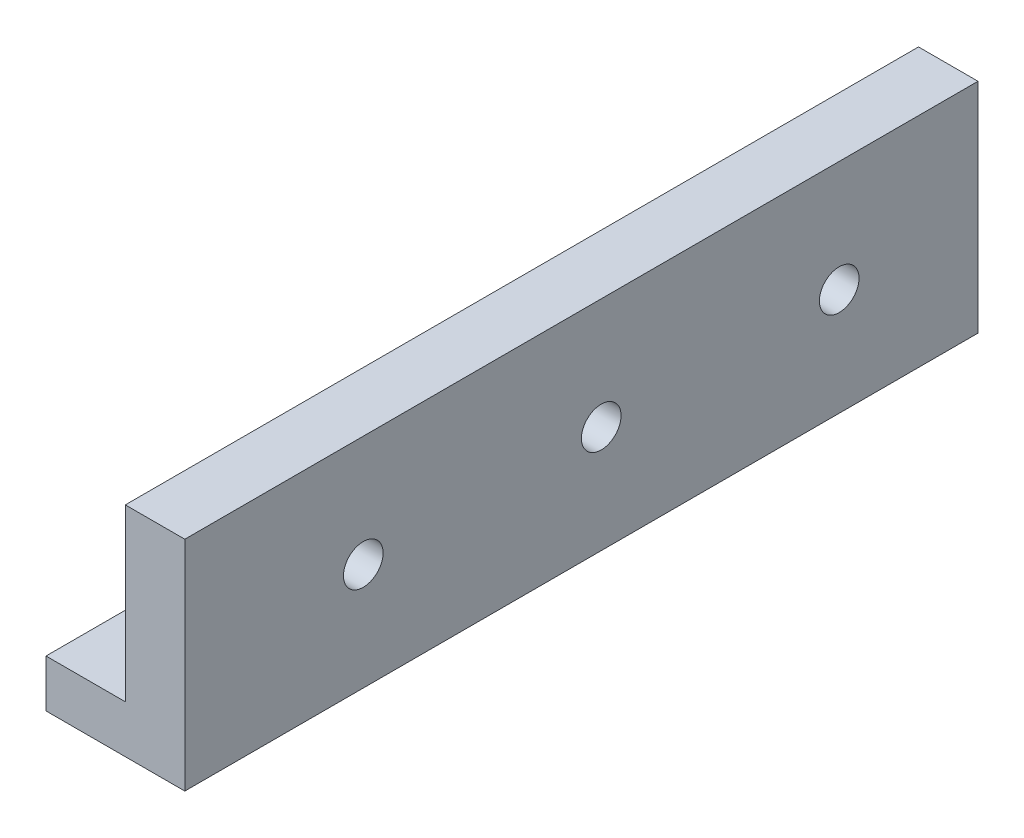
ISO-10303-21;
HEADER;
FILE_DESCRIPTION(('STEP AP214'),'2;1');
FILE_NAME('part.step','',(''),(''),'','','');
FILE_SCHEMA(('AUTOMOTIVE_DESIGN { 1 0 10303 214 1 1 1 1 }'));
ENDSEC;
DATA;
#1=APPLICATION_CONTEXT('core data for automotive mechanical design processes');
#2=APPLICATION_PROTOCOL_DEFINITION('international standard','automotive_design',2000,#1);
#3=PRODUCT_CONTEXT('',#1,'mechanical');
#4=PRODUCT('Part','Part','',(#3));
#5=PRODUCT_RELATED_PRODUCT_CATEGORY('part','',(#4));
#6=PRODUCT_DEFINITION_FORMATION('','',#4);
#7=PRODUCT_DEFINITION_CONTEXT('part definition',#1,'design');
#8=PRODUCT_DEFINITION('design','',#6,#7);
#9=PRODUCT_DEFINITION_SHAPE('','',#8);
#10=(LENGTH_UNIT() NAMED_UNIT(*) SI_UNIT(.MILLI.,.METRE.));
#11=(NAMED_UNIT(*) PLANE_ANGLE_UNIT() SI_UNIT($,.RADIAN.));
#12=(NAMED_UNIT(*) SI_UNIT($,.STERADIAN.) SOLID_ANGLE_UNIT());
#13=UNCERTAINTY_MEASURE_WITH_UNIT(LENGTH_MEASURE(1.E-05),#10,'distance_accuracy_value','');
#14=(GEOMETRIC_REPRESENTATION_CONTEXT(3) GLOBAL_UNCERTAINTY_ASSIGNED_CONTEXT((#13)) GLOBAL_UNIT_ASSIGNED_CONTEXT((#10,
#11,#12)) REPRESENTATION_CONTEXT('',''));
#15=CARTESIAN_POINT('',(0.,0.,0.));
#16=DIRECTION('',(0.,0.,1.));
#17=DIRECTION('',(1.,0.,0.));
#18=AXIS2_PLACEMENT_3D('',#15,#16,#17);
#19=CARTESIAN_POINT('',(9.98039404339138,208.805223982166,-200.));
#20=DIRECTION('',(0.,1.,0.));
#21=DIRECTION('',(0.,0.,1.));
#22=AXIS2_PLACEMENT_3D('',#19,#20,#21);
#23=PLANE('',#22);
#24=DIRECTION('',(-1.,0.,0.));
#25=VECTOR('',#24,1.);
#26=CARTESIAN_POINT('',(9.98039404339138,208.805223982166,0.));
#27=LINE('',#26,#25);
#28=CARTESIAN_POINT('',(9.98039404339138,208.805223982166,0.));
#29=VERTEX_POINT('',#28);
#30=CARTESIAN_POINT('',(-5.01960595660862,208.805223982166,0.));
#31=VERTEX_POINT('',#30);
#32=EDGE_CURVE('E118',#29,#31,#27,.T.);
#33=ORIENTED_EDGE('',*,*,#32,.F.);
#34=DIRECTION('',(0.,0.,1.));
#35=VECTOR('',#34,1.);
#36=CARTESIAN_POINT('',(9.98039404339138,208.805223982166,-200.));
#37=LINE('',#36,#35);
#38=CARTESIAN_POINT('',(9.98039404339138,208.805223982166,-200.));
#39=VERTEX_POINT('',#38);
#40=EDGE_CURVE('E11',#39,#29,#37,.T.);
#41=ORIENTED_EDGE('',*,*,#40,.F.);
#42=DIRECTION('',(-1.,0.,0.));
#43=VECTOR('',#42,1.);
#44=CARTESIAN_POINT('',(9.98039404339138,208.805223982166,-200.));
#45=LINE('',#44,#43);
#46=CARTESIAN_POINT('',(-5.01960595660862,208.805223982166,-200.));
#47=VERTEX_POINT('',#46);
#48=EDGE_CURVE('E133',#39,#47,#45,.T.);
#49=ORIENTED_EDGE('',*,*,#48,.T.);
#50=DIRECTION('',(0.,0.,1.));
#51=VECTOR('',#50,1.);
#52=CARTESIAN_POINT('',(-5.01960595660862,208.805223982166,-200.));
#53=LINE('',#52,#51);
#54=EDGE_CURVE('E36',#47,#31,#53,.T.);
#55=ORIENTED_EDGE('',*,*,#54,.T.);
#56=EDGE_LOOP('',(#33,#41,#49,#55));
#57=FACE_BOUND('',#56,.T.);
#58=ADVANCED_FACE('F33',(#57),#23,.T.);
#59=CARTESIAN_POINT('',(9.98039404339139,153.805223982166,-200.));
#60=DIRECTION('',(1.,0.,0.));
#61=DIRECTION('',(0.,1.,0.));
#62=AXIS2_PLACEMENT_3D('',#59,#60,#61);
#63=PLANE('',#62);
#64=CARTESIAN_POINT('',(9.98039404339139,180.805223982166,-45.));
#65=DIRECTION('',(1.,0.,0.));
#66=DIRECTION('',(0.,1.,0.));
#67=AXIS2_PLACEMENT_3D('',#64,#65,#66);
#68=CIRCLE('',#67,5.00000000000001);
#69=CARTESIAN_POINT('',(9.98039404339139,175.805223982166,-45.));
#70=VERTEX_POINT('',#69);
#71=EDGE_CURVE('E122',#70,#70,#68,.F.);
#72=ORIENTED_EDGE('',*,*,#71,.T.);
#73=EDGE_LOOP('',(#72));
#74=FACE_BOUND('',#73,.T.);
#75=CARTESIAN_POINT('',(9.98039404339139,180.805223982166,-105.));
#76=DIRECTION('',(1.,0.,0.));
#77=DIRECTION('',(0.,1.,0.));
#78=AXIS2_PLACEMENT_3D('',#75,#76,#77);
#79=CIRCLE('',#78,4.99999999999999);
#80=CARTESIAN_POINT('',(9.98039404339139,175.805223982166,-105.));
#81=VERTEX_POINT('',#80);
#82=EDGE_CURVE('E184',#81,#81,#79,.F.);
#83=ORIENTED_EDGE('',*,*,#82,.T.);
#84=EDGE_LOOP('',(#83));
#85=FACE_BOUND('',#84,.T.);
#86=CARTESIAN_POINT('',(9.98039404339139,180.805223982166,-165.));
#87=DIRECTION('',(1.,0.,0.));
#88=DIRECTION('',(0.,1.,0.));
#89=AXIS2_PLACEMENT_3D('',#86,#87,#88);
#90=CIRCLE('',#89,5.00000000000002);
#91=CARTESIAN_POINT('',(9.98039404339139,175.805223982166,-165.));
#92=VERTEX_POINT('',#91);
#93=EDGE_CURVE('E181',#92,#92,#90,.F.);
#94=ORIENTED_EDGE('',*,*,#93,.T.);
#95=EDGE_LOOP('',(#94));
#96=FACE_BOUND('',#95,.T.);
#97=DIRECTION('',(0.,1.,0.));
#98=VECTOR('',#97,1.);
#99=CARTESIAN_POINT('',(9.98039404339139,153.805223982166,0.));
#100=LINE('',#99,#98);
#101=CARTESIAN_POINT('',(9.98039404339139,153.805223982166,0.));
#102=VERTEX_POINT('',#101);
#103=EDGE_CURVE('E131',#102,#29,#100,.T.);
#104=ORIENTED_EDGE('',*,*,#103,.F.);
#105=DIRECTION('',(0.,0.,1.));
#106=VECTOR('',#105,1.);
#107=CARTESIAN_POINT('',(9.98039404339139,153.805223982166,-200.));
#108=LINE('',#107,#106);
#109=CARTESIAN_POINT('',(9.98039404339139,153.805223982166,-200.));
#110=VERTEX_POINT('',#109);
#111=EDGE_CURVE('E42',#110,#102,#108,.T.);
#112=ORIENTED_EDGE('',*,*,#111,.F.);
#113=DIRECTION('',(0.,1.,0.));
#114=VECTOR('',#113,1.);
#115=CARTESIAN_POINT('',(9.98039404339139,153.805223982166,-200.));
#116=LINE('',#115,#114);
#117=EDGE_CURVE('E108',#110,#39,#116,.T.);
#118=ORIENTED_EDGE('',*,*,#117,.T.);
#119=ORIENTED_EDGE('',*,*,#40,.T.);
#120=EDGE_LOOP('',(#104,#112,#118,#119));
#121=FACE_BOUND('',#120,.T.);
#122=ADVANCED_FACE('F141',(#74,#85,#96,#121),#63,.T.);
#123=CARTESIAN_POINT('',(-25.0196059566086,153.805223982166,-200.));
#124=DIRECTION('',(0.,-1.,0.));
#125=DIRECTION('',(0.,0.,-1.));
#126=AXIS2_PLACEMENT_3D('',#123,#124,#125);
#127=PLANE('',#126);
#128=DIRECTION('',(1.,0.,0.));
#129=VECTOR('',#128,1.);
#130=CARTESIAN_POINT('',(-25.0196059566086,153.805223982166,0.));
#131=LINE('',#130,#129);
#132=CARTESIAN_POINT('',(-25.0196059566086,153.805223982166,0.));
#133=VERTEX_POINT('',#132);
#134=EDGE_CURVE('E95',#133,#102,#131,.T.);
#135=ORIENTED_EDGE('',*,*,#134,.F.);
#136=DIRECTION('',(0.,0.,1.));
#137=VECTOR('',#136,1.);
#138=CARTESIAN_POINT('',(-25.0196059566086,153.805223982166,-200.));
#139=LINE('',#138,#137);
#140=CARTESIAN_POINT('',(-25.0196059566086,153.805223982166,-200.));
#141=VERTEX_POINT('',#140);
#142=EDGE_CURVE('E90',#141,#133,#139,.T.);
#143=ORIENTED_EDGE('',*,*,#142,.F.);
#144=DIRECTION('',(1.,0.,0.));
#145=VECTOR('',#144,1.);
#146=CARTESIAN_POINT('',(-25.0196059566086,153.805223982166,-200.));
#147=LINE('',#146,#145);
#148=EDGE_CURVE('E93',#141,#110,#147,.T.);
#149=ORIENTED_EDGE('',*,*,#148,.T.);
#150=ORIENTED_EDGE('',*,*,#111,.T.);
#151=EDGE_LOOP('',(#135,#143,#149,#150));
#152=FACE_BOUND('',#151,.T.);
#153=ADVANCED_FACE('F92',(#152),#127,.T.);
#154=CARTESIAN_POINT('',(-25.0196059566086,165.805223982166,-200.));
#155=DIRECTION('',(-1.,0.,0.));
#156=DIRECTION('',(0.,-1.,0.));
#157=AXIS2_PLACEMENT_3D('',#154,#155,#156);
#158=PLANE('',#157);
#159=DIRECTION('',(0.,-1.,0.));
#160=VECTOR('',#159,1.);
#161=CARTESIAN_POINT('',(-25.0196059566086,165.805223982166,0.));
#162=LINE('',#161,#160);
#163=CARTESIAN_POINT('',(-25.0196059566086,165.805223982166,0.));
#164=VERTEX_POINT('',#163);
#165=EDGE_CURVE('E128',#164,#133,#162,.T.);
#166=ORIENTED_EDGE('',*,*,#165,.F.);
#167=DIRECTION('',(0.,0.,1.));
#168=VECTOR('',#167,1.);
#169=CARTESIAN_POINT('',(-25.0196059566086,165.805223982166,-200.));
#170=LINE('',#169,#168);
#171=CARTESIAN_POINT('',(-25.0196059566086,165.805223982166,-200.));
#172=VERTEX_POINT('',#171);
#173=EDGE_CURVE('E100',#172,#164,#170,.T.);
#174=ORIENTED_EDGE('',*,*,#173,.F.);
#175=DIRECTION('',(0.,-1.,0.));
#176=VECTOR('',#175,1.);
#177=CARTESIAN_POINT('',(-25.0196059566086,165.805223982166,-200.));
#178=LINE('',#177,#176);
#179=EDGE_CURVE('E106',#172,#141,#178,.T.);
#180=ORIENTED_EDGE('',*,*,#179,.T.);
#181=ORIENTED_EDGE('',*,*,#142,.T.);
#182=EDGE_LOOP('',(#166,#174,#180,#181));
#183=FACE_BOUND('',#182,.T.);
#184=ADVANCED_FACE('F110',(#183),#158,.T.);
#185=CARTESIAN_POINT('',(-5.01960595660862,165.805223982166,-200.));
#186=DIRECTION('',(0.,1.,0.));
#187=DIRECTION('',(0.,0.,1.));
#188=AXIS2_PLACEMENT_3D('',#185,#186,#187);
#189=PLANE('',#188);
#190=DIRECTION('',(-1.,0.,0.));
#191=VECTOR('',#190,1.);
#192=CARTESIAN_POINT('',(-5.01960595660862,165.805223982166,0.));
#193=LINE('',#192,#191);
#194=CARTESIAN_POINT('',(-5.01960595660862,165.805223982166,0.));
#195=VERTEX_POINT('',#194);
#196=EDGE_CURVE('E125',#195,#164,#193,.T.);
#197=ORIENTED_EDGE('',*,*,#196,.F.);
#198=DIRECTION('',(0.,0.,1.));
#199=VECTOR('',#198,1.);
#200=CARTESIAN_POINT('',(-5.01960595660862,165.805223982166,-200.));
#201=LINE('',#200,#199);
#202=CARTESIAN_POINT('',(-5.01960595660862,165.805223982166,-200.));
#203=VERTEX_POINT('',#202);
#204=EDGE_CURVE('E136',#203,#195,#201,.T.);
#205=ORIENTED_EDGE('',*,*,#204,.F.);
#206=DIRECTION('',(-1.,0.,0.));
#207=VECTOR('',#206,1.);
#208=CARTESIAN_POINT('',(-5.01960595660862,165.805223982166,-200.));
#209=LINE('',#208,#207);
#210=EDGE_CURVE('E111',#203,#172,#209,.T.);
#211=ORIENTED_EDGE('',*,*,#210,.T.);
#212=ORIENTED_EDGE('',*,*,#173,.T.);
#213=EDGE_LOOP('',(#197,#205,#211,#212));
#214=FACE_BOUND('',#213,.T.);
#215=ADVANCED_FACE('F157',(#214),#189,.T.);
#216=CARTESIAN_POINT('',(-5.01960595660862,208.805223982166,-200.));
#217=DIRECTION('',(-1.,0.,0.));
#218=DIRECTION('',(0.,-1.,0.));
#219=AXIS2_PLACEMENT_3D('',#216,#217,#218);
#220=PLANE('',#219);
#221=CARTESIAN_POINT('',(-5.01960595660862,180.805223982166,-45.));
#222=DIRECTION('',(-1.,0.,0.));
#223=DIRECTION('',(0.,-1.,0.));
#224=AXIS2_PLACEMENT_3D('',#221,#222,#223);
#225=CIRCLE('',#224,5.00000000000001);
#226=CARTESIAN_POINT('',(-5.01960595660862,175.805223982166,-45.));
#227=VERTEX_POINT('',#226);
#228=EDGE_CURVE('E168',#227,#227,#225,.F.);
#229=ORIENTED_EDGE('',*,*,#228,.T.);
#230=EDGE_LOOP('',(#229));
#231=FACE_BOUND('',#230,.T.);
#232=CARTESIAN_POINT('',(-5.01960595660862,180.805223982166,-105.));
#233=DIRECTION('',(-1.,0.,0.));
#234=DIRECTION('',(0.,-1.,0.));
#235=AXIS2_PLACEMENT_3D('',#232,#233,#234);
#236=CIRCLE('',#235,4.99999999999999);
#237=CARTESIAN_POINT('',(-5.01960595660862,175.805223982166,-105.));
#238=VERTEX_POINT('',#237);
#239=EDGE_CURVE('E172',#238,#238,#236,.F.);
#240=ORIENTED_EDGE('',*,*,#239,.T.);
#241=EDGE_LOOP('',(#240));
#242=FACE_BOUND('',#241,.T.);
#243=CARTESIAN_POINT('',(-5.01960595660862,180.805223982166,-165.));
#244=DIRECTION('',(-1.,0.,0.));
#245=DIRECTION('',(0.,-1.,0.));
#246=AXIS2_PLACEMENT_3D('',#243,#244,#245);
#247=CIRCLE('',#246,5.00000000000002);
#248=CARTESIAN_POINT('',(-5.01960595660862,175.805223982166,-165.));
#249=VERTEX_POINT('',#248);
#250=EDGE_CURVE('E175',#249,#249,#247,.F.);
#251=ORIENTED_EDGE('',*,*,#250,.T.);
#252=EDGE_LOOP('',(#251));
#253=FACE_BOUND('',#252,.T.);
#254=DIRECTION('',(0.,-1.,0.));
#255=VECTOR('',#254,1.);
#256=CARTESIAN_POINT('',(-5.01960595660862,208.805223982166,0.));
#257=LINE('',#256,#255);
#258=EDGE_CURVE('E121',#31,#195,#257,.T.);
#259=ORIENTED_EDGE('',*,*,#258,.F.);
#260=ORIENTED_EDGE('',*,*,#54,.F.);
#261=DIRECTION('',(0.,-1.,0.));
#262=VECTOR('',#261,1.);
#263=CARTESIAN_POINT('',(-5.01960595660862,208.805223982166,-200.));
#264=LINE('',#263,#262);
#265=EDGE_CURVE('E113',#47,#203,#264,.T.);
#266=ORIENTED_EDGE('',*,*,#265,.T.);
#267=ORIENTED_EDGE('',*,*,#204,.T.);
#268=EDGE_LOOP('',(#259,#260,#266,#267));
#269=FACE_BOUND('',#268,.T.);
#270=ADVANCED_FACE('F138',(#231,#242,#253,#269),#220,.T.);
#271=CARTESIAN_POINT('',(0.,0.,-200.));
#272=DIRECTION('',(0.,0.,1.));
#273=DIRECTION('',(1.,0.,0.));
#274=AXIS2_PLACEMENT_3D('',#271,#272,#273);
#275=PLANE('',#274);
#276=ORIENTED_EDGE('',*,*,#48,.F.);
#277=ORIENTED_EDGE('',*,*,#117,.F.);
#278=ORIENTED_EDGE('',*,*,#148,.F.);
#279=ORIENTED_EDGE('',*,*,#179,.F.);
#280=ORIENTED_EDGE('',*,*,#210,.F.);
#281=ORIENTED_EDGE('',*,*,#265,.F.);
#282=EDGE_LOOP('',(#276,#277,#278,#279,#280,#281));
#283=FACE_BOUND('',#282,.T.);
#284=ADVANCED_FACE('F104',(#283),#275,.F.);
#285=CARTESIAN_POINT('',(0.,0.,0.));
#286=DIRECTION('',(0.,0.,1.));
#287=DIRECTION('',(1.,0.,0.));
#288=AXIS2_PLACEMENT_3D('',#285,#286,#287);
#289=PLANE('',#288);
#290=ORIENTED_EDGE('',*,*,#32,.T.);
#291=ORIENTED_EDGE('',*,*,#258,.T.);
#292=ORIENTED_EDGE('',*,*,#196,.T.);
#293=ORIENTED_EDGE('',*,*,#165,.T.);
#294=ORIENTED_EDGE('',*,*,#134,.T.);
#295=ORIENTED_EDGE('',*,*,#103,.T.);
#296=EDGE_LOOP('',(#290,#291,#292,#293,#294,#295));
#297=FACE_BOUND('',#296,.T.);
#298=ADVANCED_FACE('F140',(#297),#289,.T.);
#299=CARTESIAN_POINT('',(9.98040604339139,180.805223982166,-165.));
#300=DIRECTION('',(-1.,0.,0.));
#301=DIRECTION('',(0.,-1.,0.));
#302=AXIS2_PLACEMENT_3D('',#299,#300,#301);
#303=CYLINDRICAL_SURFACE('',#302,5.00000000000002);
#304=CARTESIAN_POINT('',(9.98039404339139,175.805223982166,-165.));
#305=CARTESIAN_POINT('',(9.82414404339139,175.805223982166,-165.));
#306=CARTESIAN_POINT('',(9.66789404339139,175.805223982166,-165.));
#307=CARTESIAN_POINT('',(9.35539404339139,175.805223982166,-165.));
#308=CARTESIAN_POINT('',(9.19914404339139,175.805223982166,-165.));
#309=CARTESIAN_POINT('',(8.88664404339139,175.805223982166,-165.));
#310=CARTESIAN_POINT('',(8.73039404339139,175.805223982166,-165.));
#311=CARTESIAN_POINT('',(8.41789404339139,175.805223982166,-165.));
#312=CARTESIAN_POINT('',(8.26164404339139,175.805223982166,-165.));
#313=CARTESIAN_POINT('',(7.94914404339139,175.805223982166,-165.));
#314=CARTESIAN_POINT('',(7.79289404339139,175.805223982166,-165.));
#315=CARTESIAN_POINT('',(7.48039404339139,175.805223982166,-165.));
#316=CARTESIAN_POINT('',(7.32414404339139,175.805223982166,-165.));
#317=CARTESIAN_POINT('',(7.01164404339139,175.805223982166,-165.));
#318=CARTESIAN_POINT('',(6.85539404339139,175.805223982166,-165.));
#319=CARTESIAN_POINT('',(6.54289404339139,175.805223982166,-165.));
#320=CARTESIAN_POINT('',(6.38664404339138,175.805223982166,-165.));
#321=CARTESIAN_POINT('',(6.07414404339138,175.805223982166,-165.));
#322=CARTESIAN_POINT('',(5.91789404339139,175.805223982166,-165.));
#323=CARTESIAN_POINT('',(5.60539404339139,175.805223982166,-165.));
#324=CARTESIAN_POINT('',(5.44914404339138,175.805223982166,-165.));
#325=CARTESIAN_POINT('',(5.13664404339138,175.805223982166,-165.));
#326=CARTESIAN_POINT('',(4.98039404339138,175.805223982166,-165.));
#327=CARTESIAN_POINT('',(4.66789404339138,175.805223982166,-165.));
#328=CARTESIAN_POINT('',(4.51164404339138,175.805223982166,-165.));
#329=CARTESIAN_POINT('',(4.19914404339138,175.805223982166,-165.));
#330=CARTESIAN_POINT('',(4.04289404339138,175.805223982166,-165.));
#331=CARTESIAN_POINT('',(3.73039404339138,175.805223982166,-165.));
#332=CARTESIAN_POINT('',(3.57414404339138,175.805223982166,-165.));
#333=CARTESIAN_POINT('',(3.26164404339138,175.805223982166,-165.));
#334=CARTESIAN_POINT('',(3.10539404339138,175.805223982166,-165.));
#335=CARTESIAN_POINT('',(2.79289404339138,175.805223982166,-165.));
#336=CARTESIAN_POINT('',(2.63664404339138,175.805223982166,-165.));
#337=CARTESIAN_POINT('',(2.32414404339138,175.805223982166,-165.));
#338=CARTESIAN_POINT('',(2.16789404339138,175.805223982166,-165.));
#339=CARTESIAN_POINT('',(1.85539404339138,175.805223982166,-165.));
#340=CARTESIAN_POINT('',(1.69914404339138,175.805223982166,-165.));
#341=CARTESIAN_POINT('',(1.38664404339138,175.805223982166,-165.));
#342=CARTESIAN_POINT('',(1.23039404339138,175.805223982166,-165.));
#343=CARTESIAN_POINT('',(0.917894043391381,175.805223982166,-165.));
#344=CARTESIAN_POINT('',(0.761644043391381,175.805223982166,-165.));
#345=CARTESIAN_POINT('',(0.449144043391381,175.805223982166,-165.));
#346=CARTESIAN_POINT('',(0.292894043391381,175.805223982166,-165.));
#347=CARTESIAN_POINT('',(-0.0196059566086193,175.805223982166,-165.));
#348=CARTESIAN_POINT('',(-0.175855956608619,175.805223982166,-165.));
#349=CARTESIAN_POINT('',(-0.48835595660862,175.805223982166,-165.));
#350=CARTESIAN_POINT('',(-0.64460595660862,175.805223982166,-165.));
#351=CARTESIAN_POINT('',(-0.95710595660862,175.805223982166,-165.));
#352=CARTESIAN_POINT('',(-1.11335595660862,175.805223982166,-165.));
#353=CARTESIAN_POINT('',(-1.42585595660862,175.805223982166,-165.));
#354=CARTESIAN_POINT('',(-1.58210595660862,175.805223982166,-165.));
#355=CARTESIAN_POINT('',(-1.89460595660862,175.805223982166,-165.));
#356=CARTESIAN_POINT('',(-2.05085595660862,175.805223982166,-165.));
#357=CARTESIAN_POINT('',(-2.36335595660862,175.805223982166,-165.));
#358=CARTESIAN_POINT('',(-2.51960595660862,175.805223982166,-165.));
#359=CARTESIAN_POINT('',(-2.83210595660862,175.805223982166,-165.));
#360=CARTESIAN_POINT('',(-2.98835595660862,175.805223982166,-165.));
#361=CARTESIAN_POINT('',(-3.30085595660862,175.805223982166,-165.));
#362=CARTESIAN_POINT('',(-3.45710595660862,175.805223982166,-165.));
#363=CARTESIAN_POINT('',(-3.76960595660862,175.805223982166,-165.));
#364=CARTESIAN_POINT('',(-3.92585595660862,175.805223982166,-165.));
#365=CARTESIAN_POINT('',(-4.23835595660862,175.805223982166,-165.));
#366=CARTESIAN_POINT('',(-4.39460595660862,175.805223982166,-165.));
#367=CARTESIAN_POINT('',(-4.70710595660862,175.805223982166,-165.));
#368=CARTESIAN_POINT('',(-4.86335595660862,175.805223982166,-165.));
#369=CARTESIAN_POINT('',(-5.01960595660862,175.805223982166,-165.));
#370=B_SPLINE_CURVE_WITH_KNOTS('',3,(#304,#305,#306,#307,#308,#309,#310,#311,#312,#313,#314,
#315,#316,#317,#318,#319,#320,#321,#322,#323,#324,#325,#326,#327,#328,#329,#330,#331,#332,#333,
#334,#335,#336,#337,#338,#339,#340,#341,#342,#343,#344,#345,#346,#347,#348,#349,#350,#351,#352,
#353,#354,#355,#356,#357,#358,#359,#360,#361,#362,#363,#364,#365,#366,#367,#368,#369),
.UNSPECIFIED.,.F.,.F.,(4,2,2,2,2,2,2,2,2,2,2,2,2,2,2,2,2,2,2,2,2,2,2,2,2,2,2,2,2,2,2,2,4),(0.,
0.468749999999999,0.937499999999999,1.40625,1.875,2.34375,2.8125,3.28125,3.75,4.21875,4.6875,
5.15625,5.625,6.09375,6.5625,7.03125,7.5,7.96875,8.4375,8.90625,9.37500000000001,
9.84375000000001,10.3125,10.78125,11.25,11.71875,12.1875,12.65625,13.125,13.59375,14.0625,
14.53125,15.),.UNSPECIFIED.);
#371=EDGE_CURVE('BSEAM198',#92,#249,#370,.T.);
#372=ORIENTED_EDGE('',*,*,#93,.F.);
#373=ORIENTED_EDGE('',*,*,#250,.F.);
#374=ORIENTED_EDGE('',*,*,#371,.T.);
#375=ORIENTED_EDGE('',*,*,#371,.F.);
#376=EDGE_LOOP('',(#372,#374,#373,#375));
#377=FACE_BOUND('',#376,.T.);
#378=ADVANCED_FACE('F198',(#377),#303,.F.);
#379=CARTESIAN_POINT('',(9.98040604339139,180.805223982166,-105.));
#380=DIRECTION('',(-1.,0.,0.));
#381=DIRECTION('',(0.,-1.,0.));
#382=AXIS2_PLACEMENT_3D('',#379,#380,#381);
#383=CYLINDRICAL_SURFACE('',#382,4.99999999999999);
#384=CARTESIAN_POINT('',(9.98039404339139,175.805223982166,-105.));
#385=CARTESIAN_POINT('',(9.82414404339139,175.805223982166,-105.));
#386=CARTESIAN_POINT('',(9.66789404339139,175.805223982166,-105.));
#387=CARTESIAN_POINT('',(9.35539404339139,175.805223982166,-105.));
#388=CARTESIAN_POINT('',(9.19914404339139,175.805223982166,-105.));
#389=CARTESIAN_POINT('',(8.88664404339139,175.805223982166,-105.));
#390=CARTESIAN_POINT('',(8.73039404339139,175.805223982166,-105.));
#391=CARTESIAN_POINT('',(8.41789404339139,175.805223982166,-105.));
#392=CARTESIAN_POINT('',(8.26164404339139,175.805223982166,-105.));
#393=CARTESIAN_POINT('',(7.94914404339139,175.805223982166,-105.));
#394=CARTESIAN_POINT('',(7.79289404339139,175.805223982166,-105.));
#395=CARTESIAN_POINT('',(7.48039404339139,175.805223982166,-105.));
#396=CARTESIAN_POINT('',(7.32414404339139,175.805223982166,-105.));
#397=CARTESIAN_POINT('',(7.01164404339139,175.805223982166,-105.));
#398=CARTESIAN_POINT('',(6.85539404339139,175.805223982166,-105.));
#399=CARTESIAN_POINT('',(6.54289404339139,175.805223982166,-105.));
#400=CARTESIAN_POINT('',(6.38664404339138,175.805223982166,-105.));
#401=CARTESIAN_POINT('',(6.07414404339138,175.805223982166,-105.));
#402=CARTESIAN_POINT('',(5.91789404339139,175.805223982166,-105.));
#403=CARTESIAN_POINT('',(5.60539404339139,175.805223982166,-105.));
#404=CARTESIAN_POINT('',(5.44914404339138,175.805223982166,-105.));
#405=CARTESIAN_POINT('',(5.13664404339138,175.805223982166,-105.));
#406=CARTESIAN_POINT('',(4.98039404339138,175.805223982166,-105.));
#407=CARTESIAN_POINT('',(4.66789404339138,175.805223982166,-105.));
#408=CARTESIAN_POINT('',(4.51164404339138,175.805223982166,-105.));
#409=CARTESIAN_POINT('',(4.19914404339138,175.805223982166,-105.));
#410=CARTESIAN_POINT('',(4.04289404339138,175.805223982166,-105.));
#411=CARTESIAN_POINT('',(3.73039404339138,175.805223982166,-105.));
#412=CARTESIAN_POINT('',(3.57414404339138,175.805223982166,-105.));
#413=CARTESIAN_POINT('',(3.26164404339138,175.805223982166,-105.));
#414=CARTESIAN_POINT('',(3.10539404339138,175.805223982166,-105.));
#415=CARTESIAN_POINT('',(2.79289404339138,175.805223982166,-105.));
#416=CARTESIAN_POINT('',(2.63664404339138,175.805223982166,-105.));
#417=CARTESIAN_POINT('',(2.32414404339138,175.805223982166,-105.));
#418=CARTESIAN_POINT('',(2.16789404339138,175.805223982166,-105.));
#419=CARTESIAN_POINT('',(1.85539404339138,175.805223982166,-105.));
#420=CARTESIAN_POINT('',(1.69914404339138,175.805223982166,-105.));
#421=CARTESIAN_POINT('',(1.38664404339138,175.805223982166,-105.));
#422=CARTESIAN_POINT('',(1.23039404339138,175.805223982166,-105.));
#423=CARTESIAN_POINT('',(0.917894043391381,175.805223982166,-105.));
#424=CARTESIAN_POINT('',(0.761644043391381,175.805223982166,-105.));
#425=CARTESIAN_POINT('',(0.449144043391381,175.805223982166,-105.));
#426=CARTESIAN_POINT('',(0.292894043391381,175.805223982166,-105.));
#427=CARTESIAN_POINT('',(-0.0196059566086193,175.805223982166,-105.));
#428=CARTESIAN_POINT('',(-0.175855956608619,175.805223982166,-105.));
#429=CARTESIAN_POINT('',(-0.48835595660862,175.805223982166,-105.));
#430=CARTESIAN_POINT('',(-0.64460595660862,175.805223982166,-105.));
#431=CARTESIAN_POINT('',(-0.95710595660862,175.805223982166,-105.));
#432=CARTESIAN_POINT('',(-1.11335595660862,175.805223982166,-105.));
#433=CARTESIAN_POINT('',(-1.42585595660862,175.805223982166,-105.));
#434=CARTESIAN_POINT('',(-1.58210595660862,175.805223982166,-105.));
#435=CARTESIAN_POINT('',(-1.89460595660862,175.805223982166,-105.));
#436=CARTESIAN_POINT('',(-2.05085595660862,175.805223982166,-105.));
#437=CARTESIAN_POINT('',(-2.36335595660862,175.805223982166,-105.));
#438=CARTESIAN_POINT('',(-2.51960595660862,175.805223982166,-105.));
#439=CARTESIAN_POINT('',(-2.83210595660862,175.805223982166,-105.));
#440=CARTESIAN_POINT('',(-2.98835595660862,175.805223982166,-105.));
#441=CARTESIAN_POINT('',(-3.30085595660862,175.805223982166,-105.));
#442=CARTESIAN_POINT('',(-3.45710595660862,175.805223982166,-105.));
#443=CARTESIAN_POINT('',(-3.76960595660862,175.805223982166,-105.));
#444=CARTESIAN_POINT('',(-3.92585595660862,175.805223982166,-105.));
#445=CARTESIAN_POINT('',(-4.23835595660862,175.805223982166,-105.));
#446=CARTESIAN_POINT('',(-4.39460595660862,175.805223982166,-105.));
#447=CARTESIAN_POINT('',(-4.70710595660862,175.805223982166,-105.));
#448=CARTESIAN_POINT('',(-4.86335595660862,175.805223982166,-105.));
#449=CARTESIAN_POINT('',(-5.01960595660862,175.805223982166,-105.));
#450=B_SPLINE_CURVE_WITH_KNOTS('',3,(#384,#385,#386,#387,#388,#389,#390,#391,#392,#393,#394,
#395,#396,#397,#398,#399,#400,#401,#402,#403,#404,#405,#406,#407,#408,#409,#410,#411,#412,#413,
#414,#415,#416,#417,#418,#419,#420,#421,#422,#423,#424,#425,#426,#427,#428,#429,#430,#431,#432,
#433,#434,#435,#436,#437,#438,#439,#440,#441,#442,#443,#444,#445,#446,#447,#448,#449),
.UNSPECIFIED.,.F.,.F.,(4,2,2,2,2,2,2,2,2,2,2,2,2,2,2,2,2,2,2,2,2,2,2,2,2,2,2,2,2,2,2,2,4),(0.,
0.468749999999999,0.937499999999999,1.40625,1.875,2.34375,2.8125,3.28125,3.75,4.21875,4.6875,
5.15625,5.625,6.09375,6.5625,7.03125,7.5,7.96875,8.4375,8.90625,9.37500000000001,
9.84375000000001,10.3125,10.78125,11.25,11.71875,12.1875,12.65625,13.125,13.59375,14.0625,
14.53125,15.),.UNSPECIFIED.);
#451=EDGE_CURVE('BSEAM193',#81,#238,#450,.T.);
#452=ORIENTED_EDGE('',*,*,#82,.F.);
#453=ORIENTED_EDGE('',*,*,#239,.F.);
#454=ORIENTED_EDGE('',*,*,#451,.T.);
#455=ORIENTED_EDGE('',*,*,#451,.F.);
#456=EDGE_LOOP('',(#452,#454,#453,#455));
#457=FACE_BOUND('',#456,.T.);
#458=ADVANCED_FACE('F193',(#457),#383,.F.);
#459=CARTESIAN_POINT('',(9.98040604339139,180.805223982166,-45.));
#460=DIRECTION('',(-1.,0.,0.));
#461=DIRECTION('',(0.,-1.,0.));
#462=AXIS2_PLACEMENT_3D('',#459,#460,#461);
#463=CYLINDRICAL_SURFACE('',#462,5.00000000000001);
#464=CARTESIAN_POINT('',(9.98039404339139,175.805223982166,-45.));
#465=CARTESIAN_POINT('',(9.82414404339139,175.805223982166,-45.));
#466=CARTESIAN_POINT('',(9.66789404339139,175.805223982166,-45.));
#467=CARTESIAN_POINT('',(9.35539404339139,175.805223982166,-45.));
#468=CARTESIAN_POINT('',(9.19914404339139,175.805223982166,-45.));
#469=CARTESIAN_POINT('',(8.88664404339139,175.805223982166,-45.));
#470=CARTESIAN_POINT('',(8.73039404339139,175.805223982166,-45.));
#471=CARTESIAN_POINT('',(8.41789404339139,175.805223982166,-45.));
#472=CARTESIAN_POINT('',(8.26164404339139,175.805223982166,-45.));
#473=CARTESIAN_POINT('',(7.94914404339139,175.805223982166,-45.));
#474=CARTESIAN_POINT('',(7.79289404339139,175.805223982166,-45.));
#475=CARTESIAN_POINT('',(7.48039404339139,175.805223982166,-45.));
#476=CARTESIAN_POINT('',(7.32414404339139,175.805223982166,-45.));
#477=CARTESIAN_POINT('',(7.01164404339139,175.805223982166,-45.));
#478=CARTESIAN_POINT('',(6.85539404339139,175.805223982166,-45.));
#479=CARTESIAN_POINT('',(6.54289404339139,175.805223982166,-45.));
#480=CARTESIAN_POINT('',(6.38664404339138,175.805223982166,-45.));
#481=CARTESIAN_POINT('',(6.07414404339138,175.805223982166,-45.));
#482=CARTESIAN_POINT('',(5.91789404339139,175.805223982166,-45.));
#483=CARTESIAN_POINT('',(5.60539404339139,175.805223982166,-45.));
#484=CARTESIAN_POINT('',(5.44914404339138,175.805223982166,-45.));
#485=CARTESIAN_POINT('',(5.13664404339138,175.805223982166,-45.));
#486=CARTESIAN_POINT('',(4.98039404339138,175.805223982166,-45.));
#487=CARTESIAN_POINT('',(4.66789404339138,175.805223982166,-45.));
#488=CARTESIAN_POINT('',(4.51164404339138,175.805223982166,-45.));
#489=CARTESIAN_POINT('',(4.19914404339138,175.805223982166,-45.));
#490=CARTESIAN_POINT('',(4.04289404339138,175.805223982166,-45.));
#491=CARTESIAN_POINT('',(3.73039404339138,175.805223982166,-45.));
#492=CARTESIAN_POINT('',(3.57414404339138,175.805223982166,-45.));
#493=CARTESIAN_POINT('',(3.26164404339138,175.805223982166,-45.));
#494=CARTESIAN_POINT('',(3.10539404339138,175.805223982166,-45.));
#495=CARTESIAN_POINT('',(2.79289404339138,175.805223982166,-45.));
#496=CARTESIAN_POINT('',(2.63664404339138,175.805223982166,-45.));
#497=CARTESIAN_POINT('',(2.32414404339138,175.805223982166,-45.));
#498=CARTESIAN_POINT('',(2.16789404339138,175.805223982166,-45.));
#499=CARTESIAN_POINT('',(1.85539404339138,175.805223982166,-45.));
#500=CARTESIAN_POINT('',(1.69914404339138,175.805223982166,-45.));
#501=CARTESIAN_POINT('',(1.38664404339138,175.805223982166,-45.));
#502=CARTESIAN_POINT('',(1.23039404339138,175.805223982166,-45.));
#503=CARTESIAN_POINT('',(0.917894043391381,175.805223982166,-45.));
#504=CARTESIAN_POINT('',(0.761644043391381,175.805223982166,-45.));
#505=CARTESIAN_POINT('',(0.449144043391381,175.805223982166,-45.));
#506=CARTESIAN_POINT('',(0.292894043391381,175.805223982166,-45.));
#507=CARTESIAN_POINT('',(-0.0196059566086193,175.805223982166,-45.));
#508=CARTESIAN_POINT('',(-0.175855956608619,175.805223982166,-45.));
#509=CARTESIAN_POINT('',(-0.48835595660862,175.805223982166,-45.));
#510=CARTESIAN_POINT('',(-0.64460595660862,175.805223982166,-45.));
#511=CARTESIAN_POINT('',(-0.95710595660862,175.805223982166,-45.));
#512=CARTESIAN_POINT('',(-1.11335595660862,175.805223982166,-45.));
#513=CARTESIAN_POINT('',(-1.42585595660862,175.805223982166,-45.));
#514=CARTESIAN_POINT('',(-1.58210595660862,175.805223982166,-45.));
#515=CARTESIAN_POINT('',(-1.89460595660862,175.805223982166,-45.));
#516=CARTESIAN_POINT('',(-2.05085595660862,175.805223982166,-45.));
#517=CARTESIAN_POINT('',(-2.36335595660862,175.805223982166,-45.));
#518=CARTESIAN_POINT('',(-2.51960595660862,175.805223982166,-45.));
#519=CARTESIAN_POINT('',(-2.83210595660862,175.805223982166,-45.));
#520=CARTESIAN_POINT('',(-2.98835595660862,175.805223982166,-45.));
#521=CARTESIAN_POINT('',(-3.30085595660862,175.805223982166,-45.));
#522=CARTESIAN_POINT('',(-3.45710595660862,175.805223982166,-45.));
#523=CARTESIAN_POINT('',(-3.76960595660862,175.805223982166,-45.));
#524=CARTESIAN_POINT('',(-3.92585595660862,175.805223982166,-45.));
#525=CARTESIAN_POINT('',(-4.23835595660862,175.805223982166,-45.));
#526=CARTESIAN_POINT('',(-4.39460595660862,175.805223982166,-45.));
#527=CARTESIAN_POINT('',(-4.70710595660862,175.805223982166,-45.));
#528=CARTESIAN_POINT('',(-4.86335595660862,175.805223982166,-45.));
#529=CARTESIAN_POINT('',(-5.01960595660862,175.805223982166,-45.));
#530=B_SPLINE_CURVE_WITH_KNOTS('',3,(#464,#465,#466,#467,#468,#469,#470,#471,#472,#473,#474,
#475,#476,#477,#478,#479,#480,#481,#482,#483,#484,#485,#486,#487,#488,#489,#490,#491,#492,#493,
#494,#495,#496,#497,#498,#499,#500,#501,#502,#503,#504,#505,#506,#507,#508,#509,#510,#511,#512,
#513,#514,#515,#516,#517,#518,#519,#520,#521,#522,#523,#524,#525,#526,#527,#528,#529),
.UNSPECIFIED.,.F.,.F.,(4,2,2,2,2,2,2,2,2,2,2,2,2,2,2,2,2,2,2,2,2,2,2,2,2,2,2,2,2,2,2,2,4),(0.,
0.468749999999999,0.937499999999999,1.40625,1.875,2.34375,2.8125,3.28125,3.75,4.21875,4.6875,
5.15625,5.625,6.09375,6.5625,7.03125,7.5,7.96875,8.4375,8.90625,9.37500000000001,
9.84375000000001,10.3125,10.78125,11.25,11.71875,12.1875,12.65625,13.125,13.59375,14.0625,
14.53125,15.),.UNSPECIFIED.);
#531=EDGE_CURVE('BSEAM190',#70,#227,#530,.T.);
#532=ORIENTED_EDGE('',*,*,#71,.F.);
#533=ORIENTED_EDGE('',*,*,#228,.F.);
#534=ORIENTED_EDGE('',*,*,#531,.T.);
#535=ORIENTED_EDGE('',*,*,#531,.F.);
#536=EDGE_LOOP('',(#532,#534,#533,#535));
#537=FACE_BOUND('',#536,.T.);
#538=ADVANCED_FACE('F190',(#537),#463,.F.);
#539=CLOSED_SHELL('',(#58,#122,#153,#184,#215,#270,#284,#298,#378,#458,#538));
#540=MANIFOLD_SOLID_BREP('B2',#539);
#541=ADVANCED_BREP_SHAPE_REPRESENTATION('',(#18,#540),#14);
#542=SHAPE_DEFINITION_REPRESENTATION(#9,#541);
ENDSEC;
END-ISO-10303-21;
